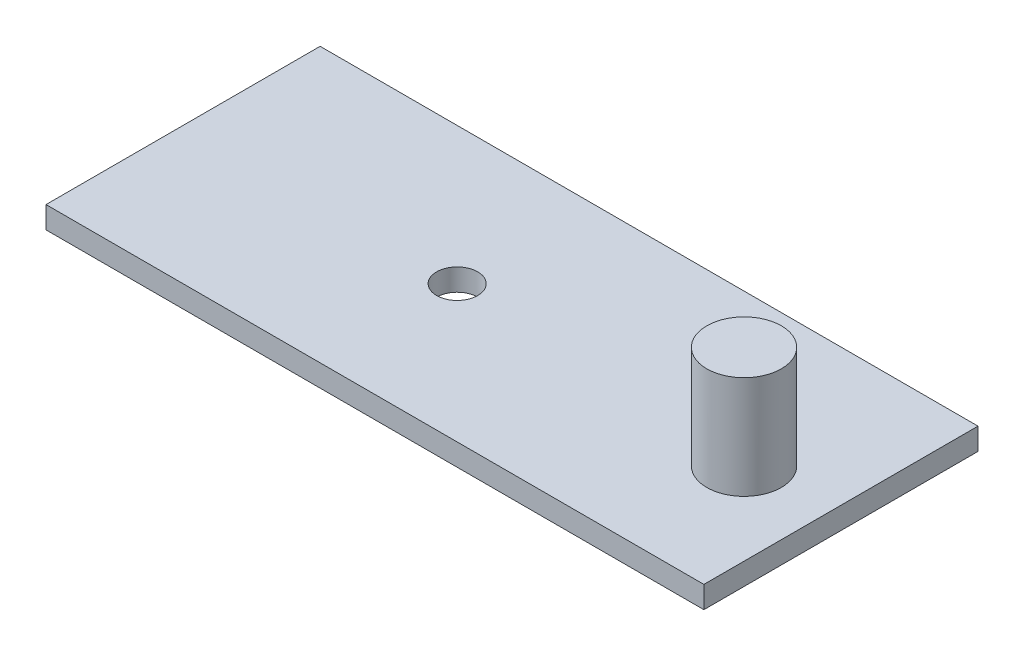
ISO-10303-21;
HEADER;
FILE_DESCRIPTION(('STEP AP214'),'2;1');
FILE_NAME('part.step','',(''),(''),'','','');
FILE_SCHEMA(('AUTOMOTIVE_DESIGN { 1 0 10303 214 1 1 1 1 }'));
ENDSEC;
DATA;
#1=APPLICATION_CONTEXT('core data for automotive mechanical design processes');
#2=APPLICATION_PROTOCOL_DEFINITION('international standard','automotive_design',2000,#1);
#3=PRODUCT_CONTEXT('',#1,'mechanical');
#4=PRODUCT('Part','Part','',(#3));
#5=PRODUCT_RELATED_PRODUCT_CATEGORY('part','',(#4));
#6=PRODUCT_DEFINITION_FORMATION('','',#4);
#7=PRODUCT_DEFINITION_CONTEXT('part definition',#1,'design');
#8=PRODUCT_DEFINITION('design','',#6,#7);
#9=PRODUCT_DEFINITION_SHAPE('','',#8);
#10=(LENGTH_UNIT() NAMED_UNIT(*) SI_UNIT(.MILLI.,.METRE.));
#11=(NAMED_UNIT(*) PLANE_ANGLE_UNIT() SI_UNIT($,.RADIAN.));
#12=(NAMED_UNIT(*) SI_UNIT($,.STERADIAN.) SOLID_ANGLE_UNIT());
#13=UNCERTAINTY_MEASURE_WITH_UNIT(LENGTH_MEASURE(1.E-05),#10,'distance_accuracy_value','');
#14=(GEOMETRIC_REPRESENTATION_CONTEXT(3) GLOBAL_UNCERTAINTY_ASSIGNED_CONTEXT((#13)) GLOBAL_UNIT_ASSIGNED_CONTEXT((#10,
#11,#12)) REPRESENTATION_CONTEXT('',''));
#15=CARTESIAN_POINT('',(0.,0.,0.));
#16=DIRECTION('',(0.,0.,1.));
#17=DIRECTION('',(1.,0.,0.));
#18=AXIS2_PLACEMENT_3D('',#15,#16,#17);
#19=CARTESIAN_POINT('',(0.,1.6,0.));
#20=DIRECTION('',(0.,-1.,0.));
#21=DIRECTION('',(0.,0.,-1.));
#22=AXIS2_PLACEMENT_3D('',#19,#20,#21);
#23=PLANE('',#22);
#24=CARTESIAN_POINT('',(41.9848263695971,1.6,-8.9471454812424));
#25=DIRECTION('',(0.,-1.,0.));
#26=DIRECTION('',(0.,0.,-1.));
#27=AXIS2_PLACEMENT_3D('',#24,#25,#26);
#28=CIRCLE('',#27,2.71918915201406);
#29=CARTESIAN_POINT('',(41.9848263695971,1.6,-11.6663346332565));
#30=VERTEX_POINT('',#29);
#31=EDGE_CURVE('E11',#30,#30,#28,.F.);
#32=ORIENTED_EDGE('',*,*,#31,.F.);
#33=EDGE_LOOP('',(#32));
#34=FACE_BOUND('',#33,.T.);
#35=DIRECTION('',(0.,0.,1.));
#36=VECTOR('',#35,1.);
#37=CARTESIAN_POINT('',(0.,1.6,0.));
#38=LINE('',#37,#36);
#39=CARTESIAN_POINT('',(0.,1.6,-20.));
#40=VERTEX_POINT('',#39);
#41=CARTESIAN_POINT('',(0.,1.6,0.));
#42=VERTEX_POINT('',#41);
#43=EDGE_CURVE('E86',#40,#42,#38,.T.);
#44=ORIENTED_EDGE('',*,*,#43,.T.);
#45=DIRECTION('',(1.,0.,0.));
#46=VECTOR('',#45,1.);
#47=CARTESIAN_POINT('',(0.,1.6,0.));
#48=LINE('',#47,#46);
#49=CARTESIAN_POINT('',(48.,1.6,0.));
#50=VERTEX_POINT('',#49);
#51=EDGE_CURVE('E81',#42,#50,#48,.T.);
#52=ORIENTED_EDGE('',*,*,#51,.T.);
#53=DIRECTION('',(0.,0.,-1.));
#54=VECTOR('',#53,1.);
#55=CARTESIAN_POINT('',(48.,1.6,0.));
#56=LINE('',#55,#54);
#57=CARTESIAN_POINT('',(48.,1.6,-20.));
#58=VERTEX_POINT('',#57);
#59=EDGE_CURVE('E84',#50,#58,#56,.T.);
#60=ORIENTED_EDGE('',*,*,#59,.T.);
#61=DIRECTION('',(-1.,0.,0.));
#62=VECTOR('',#61,1.);
#63=CARTESIAN_POINT('',(0.,1.6,-20.));
#64=LINE('',#63,#62);
#65=EDGE_CURVE('E50',#58,#40,#64,.T.);
#66=ORIENTED_EDGE('',*,*,#65,.T.);
#67=EDGE_LOOP('',(#44,#52,#60,#66));
#68=FACE_BOUND('',#67,.T.);
#69=CARTESIAN_POINT('',(20.,1.6,-10.));
#70=DIRECTION('',(0.,1.,0.));
#71=DIRECTION('',(0.,0.,1.));
#72=AXIS2_PLACEMENT_3D('',#69,#70,#71);
#73=CIRCLE('',#72,1.5);
#74=CARTESIAN_POINT('',(20.,1.6,-8.5));
#75=VERTEX_POINT('',#74);
#76=EDGE_CURVE('E103',#75,#75,#73,.T.);
#77=ORIENTED_EDGE('',*,*,#76,.F.);
#78=EDGE_LOOP('',(#77));
#79=FACE_BOUND('',#78,.T.);
#80=CARTESIAN_POINT('',(38.,1.6,-13.5));
#81=DIRECTION('',(0.,1.,0.));
#82=DIRECTION('',(0.,0.,1.));
#83=AXIS2_PLACEMENT_3D('',#80,#81,#82);
#84=CIRCLE('',#83,1.5);
#85=CARTESIAN_POINT('',(38.,1.6,-12.));
#86=VERTEX_POINT('',#85);
#87=EDGE_CURVE('E120',#86,#86,#84,.T.);
#88=ORIENTED_EDGE('',*,*,#87,.F.);
#89=EDGE_LOOP('',(#88));
#90=FACE_BOUND('',#89,.T.);
#91=ADVANCED_FACE('F33',(#34,#68,#79,#90),#23,.F.);
#92=CARTESIAN_POINT('',(0.,0.,0.));
#93=DIRECTION('',(0.,-1.,0.));
#94=DIRECTION('',(0.,0.,-1.));
#95=AXIS2_PLACEMENT_3D('',#92,#93,#94);
#96=PLANE('',#95);
#97=CARTESIAN_POINT('',(20.,0.,-10.));
#98=DIRECTION('',(0.,1.,0.));
#99=DIRECTION('',(0.,0.,1.));
#100=AXIS2_PLACEMENT_3D('',#97,#98,#99);
#101=CIRCLE('',#100,1.5);
#102=CARTESIAN_POINT('',(20.,0.,-8.5));
#103=VERTEX_POINT('',#102);
#104=EDGE_CURVE('E124',#103,#103,#101,.T.);
#105=ORIENTED_EDGE('',*,*,#104,.T.);
#106=EDGE_LOOP('',(#105));
#107=FACE_BOUND('',#106,.T.);
#108=DIRECTION('',(0.,0.,1.));
#109=VECTOR('',#108,1.);
#110=CARTESIAN_POINT('',(0.,0.,0.));
#111=LINE('',#110,#109);
#112=CARTESIAN_POINT('',(0.,0.,-20.));
#113=VERTEX_POINT('',#112);
#114=CARTESIAN_POINT('',(0.,0.,0.));
#115=VERTEX_POINT('',#114);
#116=EDGE_CURVE('E100',#113,#115,#111,.T.);
#117=ORIENTED_EDGE('',*,*,#116,.F.);
#118=DIRECTION('',(-1.,0.,0.));
#119=VECTOR('',#118,1.);
#120=CARTESIAN_POINT('',(0.,0.,-20.));
#121=LINE('',#120,#119);
#122=CARTESIAN_POINT('',(48.,0.,-20.));
#123=VERTEX_POINT('',#122);
#124=EDGE_CURVE('E73',#123,#113,#121,.T.);
#125=ORIENTED_EDGE('',*,*,#124,.F.);
#126=DIRECTION('',(0.,0.,-1.));
#127=VECTOR('',#126,1.);
#128=CARTESIAN_POINT('',(48.,0.,0.));
#129=LINE('',#128,#127);
#130=CARTESIAN_POINT('',(48.,0.,0.));
#131=VERTEX_POINT('',#130);
#132=EDGE_CURVE('E67',#131,#123,#129,.T.);
#133=ORIENTED_EDGE('',*,*,#132,.F.);
#134=DIRECTION('',(1.,0.,0.));
#135=VECTOR('',#134,1.);
#136=CARTESIAN_POINT('',(0.,0.,0.));
#137=LINE('',#136,#135);
#138=EDGE_CURVE('E91',#115,#131,#137,.T.);
#139=ORIENTED_EDGE('',*,*,#138,.F.);
#140=EDGE_LOOP('',(#117,#125,#133,#139));
#141=FACE_BOUND('',#140,.T.);
#142=CARTESIAN_POINT('',(38.,0.,-13.5));
#143=DIRECTION('',(0.,1.,0.));
#144=DIRECTION('',(0.,0.,1.));
#145=AXIS2_PLACEMENT_3D('',#142,#143,#144);
#146=CIRCLE('',#145,1.5);
#147=CARTESIAN_POINT('',(38.,0.,-12.));
#148=VERTEX_POINT('',#147);
#149=EDGE_CURVE('E118',#148,#148,#146,.T.);
#150=ORIENTED_EDGE('',*,*,#149,.T.);
#151=EDGE_LOOP('',(#150));
#152=FACE_BOUND('',#151,.T.);
#153=ADVANCED_FACE('F111',(#107,#141,#152),#96,.T.);
#154=CARTESIAN_POINT('',(0.,1.6,0.));
#155=DIRECTION('',(1.,0.,0.));
#156=DIRECTION('',(0.,0.,-1.));
#157=AXIS2_PLACEMENT_3D('',#154,#155,#156);
#158=PLANE('',#157);
#159=ORIENTED_EDGE('',*,*,#116,.T.);
#160=DIRECTION('',(0.,-1.,0.));
#161=VECTOR('',#160,1.);
#162=CARTESIAN_POINT('',(0.,1.6,0.));
#163=LINE('',#162,#161);
#164=EDGE_CURVE('E42',#42,#115,#163,.T.);
#165=ORIENTED_EDGE('',*,*,#164,.F.);
#166=ORIENTED_EDGE('',*,*,#43,.F.);
#167=DIRECTION('',(0.,-1.,0.));
#168=VECTOR('',#167,1.);
#169=CARTESIAN_POINT('',(0.,1.6,-20.));
#170=LINE('',#169,#168);
#171=EDGE_CURVE('E96',#40,#113,#170,.T.);
#172=ORIENTED_EDGE('',*,*,#171,.T.);
#173=EDGE_LOOP('',(#159,#165,#166,#172));
#174=FACE_BOUND('',#173,.T.);
#175=ADVANCED_FACE('F35',(#174),#158,.F.);
#176=CARTESIAN_POINT('',(0.,1.6,0.));
#177=DIRECTION('',(0.,0.,-1.));
#178=DIRECTION('',(-1.,0.,0.));
#179=AXIS2_PLACEMENT_3D('',#176,#177,#178);
#180=PLANE('',#179);
#181=ORIENTED_EDGE('',*,*,#138,.T.);
#182=DIRECTION('',(0.,-1.,0.));
#183=VECTOR('',#182,1.);
#184=CARTESIAN_POINT('',(48.,1.6,0.));
#185=LINE('',#184,#183);
#186=EDGE_CURVE('E89',#50,#131,#185,.T.);
#187=ORIENTED_EDGE('',*,*,#186,.F.);
#188=ORIENTED_EDGE('',*,*,#51,.F.);
#189=ORIENTED_EDGE('',*,*,#164,.T.);
#190=EDGE_LOOP('',(#181,#187,#188,#189));
#191=FACE_BOUND('',#190,.T.);
#192=ADVANCED_FACE('F90',(#191),#180,.F.);
#193=CARTESIAN_POINT('',(48.,1.6,0.));
#194=DIRECTION('',(-1.,0.,0.));
#195=DIRECTION('',(0.,0.,1.));
#196=AXIS2_PLACEMENT_3D('',#193,#194,#195);
#197=PLANE('',#196);
#198=ORIENTED_EDGE('',*,*,#132,.T.);
#199=DIRECTION('',(0.,-1.,0.));
#200=VECTOR('',#199,1.);
#201=CARTESIAN_POINT('',(48.,1.6,-20.));
#202=LINE('',#201,#200);
#203=EDGE_CURVE('E92',#58,#123,#202,.T.);
#204=ORIENTED_EDGE('',*,*,#203,.F.);
#205=ORIENTED_EDGE('',*,*,#59,.F.);
#206=ORIENTED_EDGE('',*,*,#186,.T.);
#207=EDGE_LOOP('',(#198,#204,#205,#206));
#208=FACE_BOUND('',#207,.T.);
#209=ADVANCED_FACE('F94',(#208),#197,.F.);
#210=CARTESIAN_POINT('',(0.,1.6,-20.));
#211=DIRECTION('',(0.,0.,1.));
#212=DIRECTION('',(1.,0.,0.));
#213=AXIS2_PLACEMENT_3D('',#210,#211,#212);
#214=PLANE('',#213);
#215=ORIENTED_EDGE('',*,*,#124,.T.);
#216=ORIENTED_EDGE('',*,*,#171,.F.);
#217=ORIENTED_EDGE('',*,*,#65,.F.);
#218=ORIENTED_EDGE('',*,*,#203,.T.);
#219=EDGE_LOOP('',(#215,#216,#217,#218));
#220=FACE_BOUND('',#219,.T.);
#221=ADVANCED_FACE('F137',(#220),#214,.F.);
#222=CARTESIAN_POINT('',(20.,1.6,-10.));
#223=DIRECTION('',(0.,-1.,0.));
#224=DIRECTION('',(0.,0.,-1.));
#225=AXIS2_PLACEMENT_3D('',#222,#223,#224);
#226=CYLINDRICAL_SURFACE('',#225,1.5);
#227=ORIENTED_EDGE('',*,*,#76,.T.);
#228=EDGE_LOOP('',(#227));
#229=FACE_BOUND('',#228,.T.);
#230=ORIENTED_EDGE('',*,*,#104,.F.);
#231=EDGE_LOOP('',(#230));
#232=FACE_BOUND('',#231,.T.);
#233=ADVANCED_FACE('F134',(#229,#232),#226,.F.);
#234=CARTESIAN_POINT('',(38.,1.6,-13.5));
#235=DIRECTION('',(0.,-1.,0.));
#236=DIRECTION('',(0.,0.,-1.));
#237=AXIS2_PLACEMENT_3D('',#234,#235,#236);
#238=CYLINDRICAL_SURFACE('',#237,1.5);
#239=ORIENTED_EDGE('',*,*,#87,.T.);
#240=EDGE_LOOP('',(#239));
#241=FACE_BOUND('',#240,.T.);
#242=ORIENTED_EDGE('',*,*,#149,.F.);
#243=EDGE_LOOP('',(#242));
#244=FACE_BOUND('',#243,.T.);
#245=ADVANCED_FACE('F136',(#241,#244),#238,.F.);
#246=CARTESIAN_POINT('',(41.9848263695971,9.1,-8.9471454812424));
#247=DIRECTION('',(0.,-1.,0.));
#248=DIRECTION('',(0.,0.,-1.));
#249=AXIS2_PLACEMENT_3D('',#246,#247,#248);
#250=CYLINDRICAL_SURFACE('',#249,2.71918915201406);
#251=CARTESIAN_POINT('',(41.9848263695971,9.1,-8.9471454812424));
#252=DIRECTION('',(0.,1.,0.));
#253=DIRECTION('',(0.,0.,1.));
#254=AXIS2_PLACEMENT_3D('',#251,#252,#253);
#255=CIRCLE('',#254,2.71918915201406);
#256=CARTESIAN_POINT('',(41.9848263695971,9.1,-6.22795632922834));
#257=VERTEX_POINT('',#256);
#258=EDGE_CURVE('E121',#257,#257,#255,.T.);
#259=ORIENTED_EDGE('',*,*,#258,.F.);
#260=EDGE_LOOP('',(#259));
#261=FACE_BOUND('',#260,.T.);
#262=ORIENTED_EDGE('',*,*,#31,.T.);
#263=EDGE_LOOP('',(#262));
#264=FACE_BOUND('',#263,.T.);
#265=ADVANCED_FACE('F144',(#261,#264),#250,.T.);
#266=CARTESIAN_POINT('',(41.9848263695971,9.1,-8.9471454812424));
#267=DIRECTION('',(0.,1.,0.));
#268=DIRECTION('',(0.,0.,1.));
#269=AXIS2_PLACEMENT_3D('',#266,#267,#268);
#270=PLANE('',#269);
#271=ORIENTED_EDGE('',*,*,#258,.T.);
#272=EDGE_LOOP('',(#271));
#273=FACE_BOUND('',#272,.T.);
#274=ADVANCED_FACE('F204',(#273),#270,.T.);
#275=CLOSED_SHELL('',(#91,#153,#175,#192,#209,#221,#233,#245,#265,#274));
#276=MANIFOLD_SOLID_BREP('B2',#275);
#277=ADVANCED_BREP_SHAPE_REPRESENTATION('',(#18,#276),#14);
#278=SHAPE_DEFINITION_REPRESENTATION(#9,#277);
ENDSEC;
END-ISO-10303-21;
